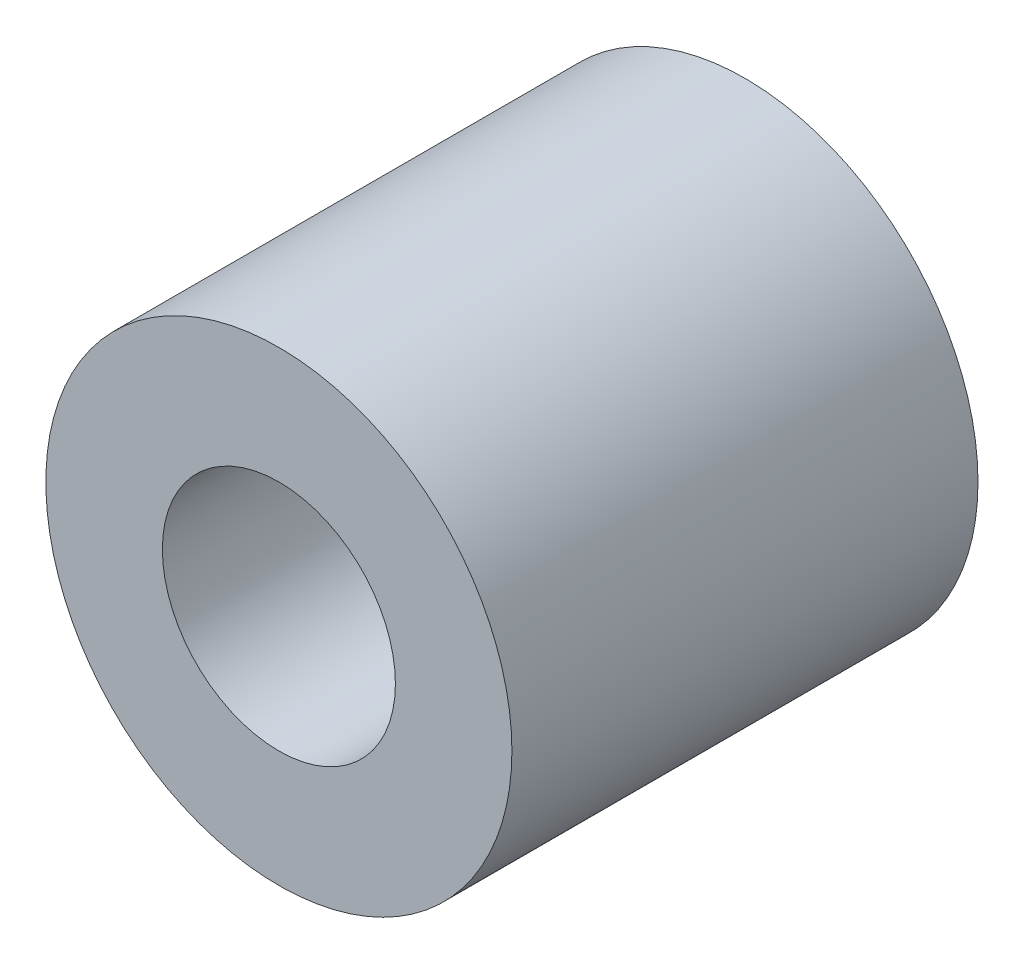
ISO-10303-21;
HEADER;
FILE_DESCRIPTION(('STEP AP214'),'2;1');
FILE_NAME('part.step','',(''),(''),'','','');
FILE_SCHEMA(('AUTOMOTIVE_DESIGN { 1 0 10303 214 1 1 1 1 }'));
ENDSEC;
DATA;
#1=APPLICATION_CONTEXT('core data for automotive mechanical design processes');
#2=APPLICATION_PROTOCOL_DEFINITION('international standard','automotive_design',2000,#1);
#3=PRODUCT_CONTEXT('',#1,'mechanical');
#4=PRODUCT('Part','Part','',(#3));
#5=PRODUCT_RELATED_PRODUCT_CATEGORY('part','',(#4));
#6=PRODUCT_DEFINITION_FORMATION('','',#4);
#7=PRODUCT_DEFINITION_CONTEXT('part definition',#1,'design');
#8=PRODUCT_DEFINITION('design','',#6,#7);
#9=PRODUCT_DEFINITION_SHAPE('','',#8);
#10=(LENGTH_UNIT() NAMED_UNIT(*) SI_UNIT(.MILLI.,.METRE.));
#11=(NAMED_UNIT(*) PLANE_ANGLE_UNIT() SI_UNIT($,.RADIAN.));
#12=(NAMED_UNIT(*) SI_UNIT($,.STERADIAN.) SOLID_ANGLE_UNIT());
#13=UNCERTAINTY_MEASURE_WITH_UNIT(LENGTH_MEASURE(1.E-05),#10,'distance_accuracy_value','');
#14=(GEOMETRIC_REPRESENTATION_CONTEXT(3) GLOBAL_UNCERTAINTY_ASSIGNED_CONTEXT((#13)) GLOBAL_UNIT_ASSIGNED_CONTEXT((#10,
#11,#12)) REPRESENTATION_CONTEXT('',''));
#15=CARTESIAN_POINT('',(0.,0.,0.));
#16=DIRECTION('',(0.,0.,1.));
#17=DIRECTION('',(1.,0.,0.));
#18=AXIS2_PLACEMENT_3D('',#15,#16,#17);
#19=CARTESIAN_POINT('',(0.,0.,12.7));
#20=DIRECTION('',(0.,0.,-1.));
#21=DIRECTION('',(-1.,0.,0.));
#22=AXIS2_PLACEMENT_3D('',#19,#20,#21);
#23=CYLINDRICAL_SURFACE('',#22,6.35);
#24=CARTESIAN_POINT('',(0.,0.,12.7));
#25=DIRECTION('',(0.,0.,1.));
#26=DIRECTION('',(1.,0.,0.));
#27=AXIS2_PLACEMENT_3D('',#24,#25,#26);
#28=CIRCLE('',#27,6.35);
#29=CARTESIAN_POINT('',(6.35,0.,12.7));
#30=VERTEX_POINT('',#29);
#31=EDGE_CURVE('E10',#30,#30,#28,.T.);
#32=ORIENTED_EDGE('',*,*,#31,.F.);
#33=EDGE_LOOP('',(#32));
#34=FACE_BOUND('',#33,.T.);
#35=CARTESIAN_POINT('',(0.,0.,0.));
#36=DIRECTION('',(0.,0.,1.));
#37=DIRECTION('',(1.,0.,0.));
#38=AXIS2_PLACEMENT_3D('',#35,#36,#37);
#39=CIRCLE('',#38,6.35);
#40=CARTESIAN_POINT('',(6.35,0.,0.));
#41=VERTEX_POINT('',#40);
#42=EDGE_CURVE('E40',#41,#41,#39,.T.);
#43=ORIENTED_EDGE('',*,*,#42,.T.);
#44=EDGE_LOOP('',(#43));
#45=FACE_BOUND('',#44,.T.);
#46=ADVANCED_FACE('F37',(#34,#45),#23,.T.);
#47=CARTESIAN_POINT('',(0.,0.,12.7));
#48=DIRECTION('',(0.,0.,1.));
#49=DIRECTION('',(1.,0.,0.));
#50=AXIS2_PLACEMENT_3D('',#47,#48,#49);
#51=PLANE('',#50);
#52=CARTESIAN_POINT('',(0.,0.,12.7));
#53=DIRECTION('',(0.,0.,1.));
#54=DIRECTION('',(1.,0.,0.));
#55=AXIS2_PLACEMENT_3D('',#52,#53,#54);
#56=CIRCLE('',#55,3.175);
#57=CARTESIAN_POINT('',(3.175,0.,12.7));
#58=VERTEX_POINT('',#57);
#59=EDGE_CURVE('E51',#58,#58,#56,.T.);
#60=ORIENTED_EDGE('',*,*,#59,.F.);
#61=EDGE_LOOP('',(#60));
#62=FACE_BOUND('',#61,.T.);
#63=ORIENTED_EDGE('',*,*,#31,.T.);
#64=EDGE_LOOP('',(#63));
#65=FACE_BOUND('',#64,.T.);
#66=ADVANCED_FACE('F68',(#62,#65),#51,.T.);
#67=CARTESIAN_POINT('',(0.,0.,0.));
#68=DIRECTION('',(0.,0.,1.));
#69=DIRECTION('',(1.,0.,0.));
#70=AXIS2_PLACEMENT_3D('',#67,#68,#69);
#71=PLANE('',#70);
#72=CARTESIAN_POINT('',(0.,0.,0.));
#73=DIRECTION('',(0.,0.,1.));
#74=DIRECTION('',(1.,0.,0.));
#75=AXIS2_PLACEMENT_3D('',#72,#73,#74);
#76=CIRCLE('',#75,3.175);
#77=CARTESIAN_POINT('',(3.175,0.,0.));
#78=VERTEX_POINT('',#77);
#79=EDGE_CURVE('E49',#78,#78,#76,.T.);
#80=ORIENTED_EDGE('',*,*,#79,.T.);
#81=EDGE_LOOP('',(#80));
#82=FACE_BOUND('',#81,.T.);
#83=ORIENTED_EDGE('',*,*,#42,.F.);
#84=EDGE_LOOP('',(#83));
#85=FACE_BOUND('',#84,.T.);
#86=ADVANCED_FACE('F59',(#82,#85),#71,.F.);
#87=CARTESIAN_POINT('',(0.,0.,0.));
#88=DIRECTION('',(0.,0.,1.));
#89=DIRECTION('',(1.,0.,0.));
#90=AXIS2_PLACEMENT_3D('',#87,#88,#89);
#91=CYLINDRICAL_SURFACE('',#90,3.175);
#92=ORIENTED_EDGE('',*,*,#79,.F.);
#93=EDGE_LOOP('',(#92));
#94=FACE_BOUND('',#93,.T.);
#95=ORIENTED_EDGE('',*,*,#59,.T.);
#96=EDGE_LOOP('',(#95));
#97=FACE_BOUND('',#96,.T.);
#98=ADVANCED_FACE('F62',(#94,#97),#91,.F.);
#99=CLOSED_SHELL('',(#46,#66,#86,#98));
#100=MANIFOLD_SOLID_BREP('B2',#99);
#101=ADVANCED_BREP_SHAPE_REPRESENTATION('',(#18,#100),#14);
#102=SHAPE_DEFINITION_REPRESENTATION(#9,#101);
ENDSEC;
END-ISO-10303-21;
